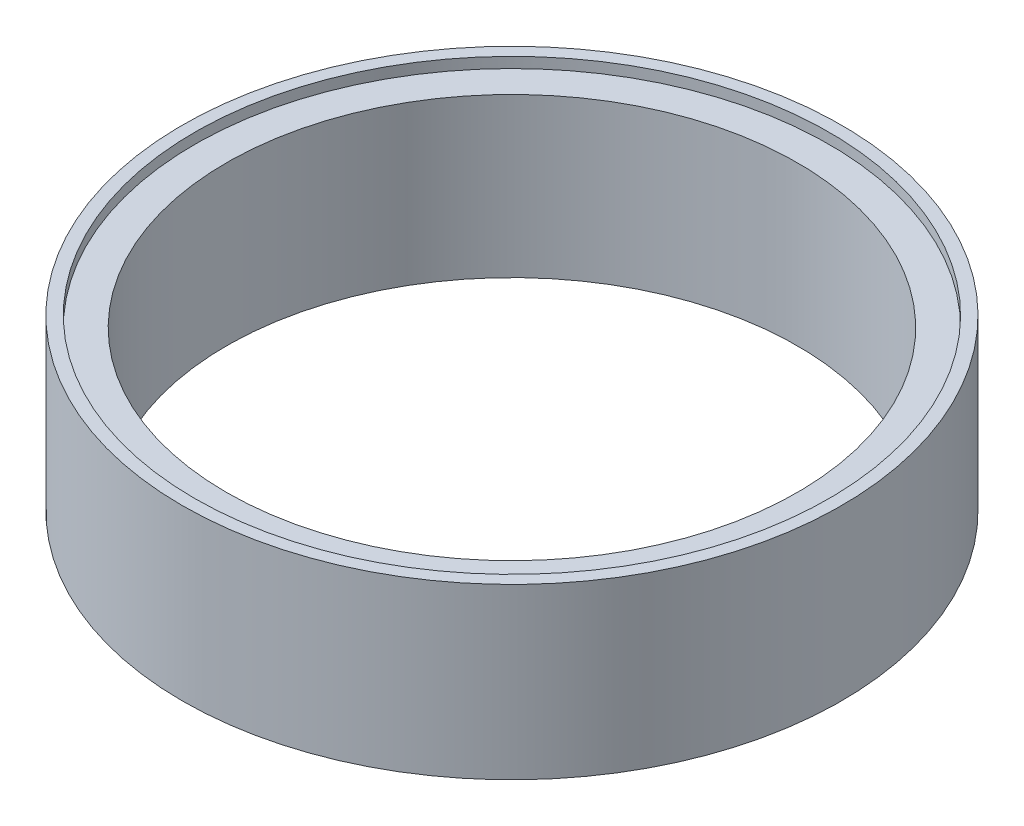
ISO-10303-21;
HEADER;
FILE_DESCRIPTION(('STEP AP214'),'2;1');
FILE_NAME('part.step','',(''),(''),'','','');
FILE_SCHEMA(('AUTOMOTIVE_DESIGN { 1 0 10303 214 1 1 1 1 }'));
ENDSEC;
DATA;
#1=APPLICATION_CONTEXT('core data for automotive mechanical design processes');
#2=APPLICATION_PROTOCOL_DEFINITION('international standard','automotive_design',2000,#1);
#3=PRODUCT_CONTEXT('',#1,'mechanical');
#4=PRODUCT('Part','Part','',(#3));
#5=PRODUCT_RELATED_PRODUCT_CATEGORY('part','',(#4));
#6=PRODUCT_DEFINITION_FORMATION('','',#4);
#7=PRODUCT_DEFINITION_CONTEXT('part definition',#1,'design');
#8=PRODUCT_DEFINITION('design','',#6,#7);
#9=PRODUCT_DEFINITION_SHAPE('','',#8);
#10=(LENGTH_UNIT() NAMED_UNIT(*) SI_UNIT(.MILLI.,.METRE.));
#11=(NAMED_UNIT(*) PLANE_ANGLE_UNIT() SI_UNIT($,.RADIAN.));
#12=(NAMED_UNIT(*) SI_UNIT($,.STERADIAN.) SOLID_ANGLE_UNIT());
#13=UNCERTAINTY_MEASURE_WITH_UNIT(LENGTH_MEASURE(1.E-05),#10,'distance_accuracy_value','');
#14=(GEOMETRIC_REPRESENTATION_CONTEXT(3) GLOBAL_UNCERTAINTY_ASSIGNED_CONTEXT((#13)) GLOBAL_UNIT_ASSIGNED_CONTEXT((#10,
#11,#12)) REPRESENTATION_CONTEXT('',''));
#15=CARTESIAN_POINT('',(0.,0.,0.));
#16=DIRECTION('',(0.,0.,1.));
#17=DIRECTION('',(1.,0.,0.));
#18=AXIS2_PLACEMENT_3D('',#15,#16,#17);
#19=CARTESIAN_POINT('',(0.,0.,0.));
#20=DIRECTION('',(0.,1.,0.));
#21=DIRECTION('',(0.,0.,1.));
#22=AXIS2_PLACEMENT_3D('',#19,#20,#21);
#23=CYLINDRICAL_SURFACE('',#22,8.1);
#24=CARTESIAN_POINT('',(0.,0.,0.));
#25=DIRECTION('',(0.,1.,0.));
#26=DIRECTION('',(0.,0.,1.));
#27=AXIS2_PLACEMENT_3D('',#24,#25,#26);
#28=CIRCLE('',#27,8.1);
#29=CARTESIAN_POINT('',(0.,0.,8.1));
#30=VERTEX_POINT('',#29);
#31=EDGE_CURVE('E52',#30,#30,#28,.T.);
#32=ORIENTED_EDGE('',*,*,#31,.F.);
#33=EDGE_LOOP('',(#32));
#34=FACE_BOUND('',#33,.T.);
#35=CARTESIAN_POINT('',(0.,4.5,0.));
#36=DIRECTION('',(0.,1.,0.));
#37=DIRECTION('',(0.,0.,1.));
#38=AXIS2_PLACEMENT_3D('',#35,#36,#37);
#39=CIRCLE('',#38,8.1);
#40=CARTESIAN_POINT('',(0.,4.5,8.1));
#41=VERTEX_POINT('',#40);
#42=EDGE_CURVE('E41',#41,#41,#39,.F.);
#43=ORIENTED_EDGE('',*,*,#42,.F.);
#44=EDGE_LOOP('',(#43));
#45=FACE_BOUND('',#44,.T.);
#46=ADVANCED_FACE('F37',(#34,#45),#23,.F.);
#47=CARTESIAN_POINT('',(0.,4.8,0.));
#48=DIRECTION('',(0.,-1.,0.));
#49=DIRECTION('',(0.,0.,-1.));
#50=AXIS2_PLACEMENT_3D('',#47,#48,#49);
#51=CYLINDRICAL_SURFACE('',#50,9.35);
#52=CARTESIAN_POINT('',(0.,4.8,0.));
#53=DIRECTION('',(0.,1.,0.));
#54=DIRECTION('',(0.,0.,1.));
#55=AXIS2_PLACEMENT_3D('',#52,#53,#54);
#56=CIRCLE('',#55,9.35);
#57=CARTESIAN_POINT('',(0.,4.8,9.35));
#58=VERTEX_POINT('',#57);
#59=EDGE_CURVE('E10',#58,#58,#56,.T.);
#60=ORIENTED_EDGE('',*,*,#59,.F.);
#61=EDGE_LOOP('',(#60));
#62=FACE_BOUND('',#61,.T.);
#63=CARTESIAN_POINT('',(0.,0.,0.));
#64=DIRECTION('',(0.,1.,0.));
#65=DIRECTION('',(0.,0.,1.));
#66=AXIS2_PLACEMENT_3D('',#63,#64,#65);
#67=CIRCLE('',#66,9.35);
#68=CARTESIAN_POINT('',(0.,0.,9.35));
#69=VERTEX_POINT('',#68);
#70=EDGE_CURVE('E46',#69,#69,#67,.T.);
#71=ORIENTED_EDGE('',*,*,#70,.T.);
#72=EDGE_LOOP('',(#71));
#73=FACE_BOUND('',#72,.T.);
#74=ADVANCED_FACE('F39',(#62,#73),#51,.T.);
#75=CARTESIAN_POINT('',(0.,4.8,0.));
#76=DIRECTION('',(0.,1.,0.));
#77=DIRECTION('',(0.,0.,1.));
#78=AXIS2_PLACEMENT_3D('',#75,#76,#77);
#79=PLANE('',#78);
#80=CARTESIAN_POINT('',(0.,4.8,0.));
#81=DIRECTION('',(0.,1.,0.));
#82=DIRECTION('',(0.,0.,1.));
#83=AXIS2_PLACEMENT_3D('',#80,#81,#82);
#84=CIRCLE('',#83,9.);
#85=CARTESIAN_POINT('',(0.,4.8,9.));
#86=VERTEX_POINT('',#85);
#87=EDGE_CURVE('E57',#86,#86,#84,.T.);
#88=ORIENTED_EDGE('',*,*,#87,.F.);
#89=EDGE_LOOP('',(#88));
#90=FACE_BOUND('',#89,.T.);
#91=ORIENTED_EDGE('',*,*,#59,.T.);
#92=EDGE_LOOP('',(#91));
#93=FACE_BOUND('',#92,.T.);
#94=ADVANCED_FACE('F78',(#90,#93),#79,.T.);
#95=CARTESIAN_POINT('',(0.,0.,0.));
#96=DIRECTION('',(0.,1.,0.));
#97=DIRECTION('',(0.,0.,1.));
#98=AXIS2_PLACEMENT_3D('',#95,#96,#97);
#99=PLANE('',#98);
#100=ORIENTED_EDGE('',*,*,#31,.T.);
#101=EDGE_LOOP('',(#100));
#102=FACE_BOUND('',#101,.T.);
#103=ORIENTED_EDGE('',*,*,#70,.F.);
#104=EDGE_LOOP('',(#103));
#105=FACE_BOUND('',#104,.T.);
#106=ADVANCED_FACE('F86',(#102,#105),#99,.F.);
#107=CARTESIAN_POINT('',(0.,4.5,0.));
#108=DIRECTION('',(0.,1.,0.));
#109=DIRECTION('',(0.,0.,1.));
#110=AXIS2_PLACEMENT_3D('',#107,#108,#109);
#111=PLANE('',#110);
#112=CARTESIAN_POINT('',(0.,4.5,0.));
#113=DIRECTION('',(0.,1.,0.));
#114=DIRECTION('',(0.,0.,1.));
#115=AXIS2_PLACEMENT_3D('',#112,#113,#114);
#116=CIRCLE('',#115,9.);
#117=CARTESIAN_POINT('',(0.,4.5,9.));
#118=VERTEX_POINT('',#117);
#119=EDGE_CURVE('E61',#118,#118,#116,.T.);
#120=ORIENTED_EDGE('',*,*,#119,.T.);
#121=EDGE_LOOP('',(#120));
#122=FACE_BOUND('',#121,.T.);
#123=ORIENTED_EDGE('',*,*,#42,.T.);
#124=EDGE_LOOP('',(#123));
#125=FACE_BOUND('',#124,.T.);
#126=ADVANCED_FACE('F70',(#122,#125),#111,.T.);
#127=CARTESIAN_POINT('',(0.,4.5,0.));
#128=DIRECTION('',(0.,1.,0.));
#129=DIRECTION('',(0.,0.,1.));
#130=AXIS2_PLACEMENT_3D('',#127,#128,#129);
#131=CYLINDRICAL_SURFACE('',#130,9.);
#132=ORIENTED_EDGE('',*,*,#119,.F.);
#133=EDGE_LOOP('',(#132));
#134=FACE_BOUND('',#133,.T.);
#135=ORIENTED_EDGE('',*,*,#87,.T.);
#136=EDGE_LOOP('',(#135));
#137=FACE_BOUND('',#136,.T.);
#138=ADVANCED_FACE('F83',(#134,#137),#131,.F.);
#139=CLOSED_SHELL('',(#46,#74,#94,#106,#126,#138));
#140=MANIFOLD_SOLID_BREP('B2',#139);
#141=ADVANCED_BREP_SHAPE_REPRESENTATION('',(#18,#140),#14);
#142=SHAPE_DEFINITION_REPRESENTATION(#9,#141);
ENDSEC;
END-ISO-10303-21;
